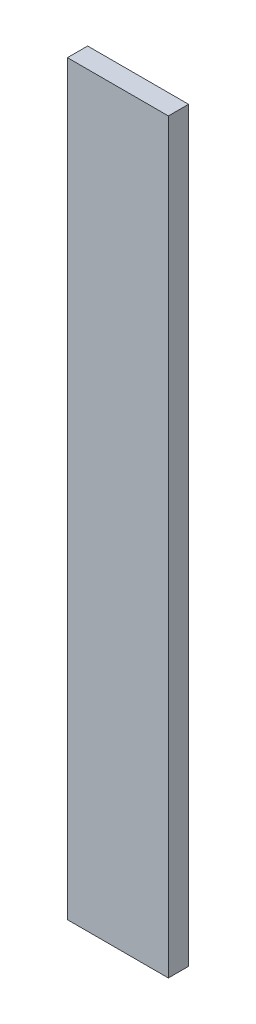
ISO-10303-21;
HEADER;
FILE_DESCRIPTION(('STEP AP214'),'2;1');
FILE_NAME('part.step','',(''),(''),'','','');
FILE_SCHEMA(('AUTOMOTIVE_DESIGN { 1 0 10303 214 1 1 1 1 }'));
ENDSEC;
DATA;
#1=APPLICATION_CONTEXT('core data for automotive mechanical design processes');
#2=APPLICATION_PROTOCOL_DEFINITION('international standard','automotive_design',2000,#1);
#3=PRODUCT_CONTEXT('',#1,'mechanical');
#4=PRODUCT('Part','Part','',(#3));
#5=PRODUCT_RELATED_PRODUCT_CATEGORY('part','',(#4));
#6=PRODUCT_DEFINITION_FORMATION('','',#4);
#7=PRODUCT_DEFINITION_CONTEXT('part definition',#1,'design');
#8=PRODUCT_DEFINITION('design','',#6,#7);
#9=PRODUCT_DEFINITION_SHAPE('','',#8);
#10=(LENGTH_UNIT() NAMED_UNIT(*) SI_UNIT(.MILLI.,.METRE.));
#11=(NAMED_UNIT(*) PLANE_ANGLE_UNIT() SI_UNIT($,.RADIAN.));
#12=(NAMED_UNIT(*) SI_UNIT($,.STERADIAN.) SOLID_ANGLE_UNIT());
#13=UNCERTAINTY_MEASURE_WITH_UNIT(LENGTH_MEASURE(1.E-05),#10,'distance_accuracy_value','');
#14=(GEOMETRIC_REPRESENTATION_CONTEXT(3) GLOBAL_UNCERTAINTY_ASSIGNED_CONTEXT((#13)) GLOBAL_UNIT_ASSIGNED_CONTEXT((#10,
#11,#12)) REPRESENTATION_CONTEXT('',''));
#15=CARTESIAN_POINT('',(0.,0.,0.));
#16=DIRECTION('',(0.,0.,1.));
#17=DIRECTION('',(1.,0.,0.));
#18=AXIS2_PLACEMENT_3D('',#15,#16,#17);
#19=CARTESIAN_POINT('',(50.6216819724827,39.0353646252086,118.017510674416));
#20=DIRECTION('',(-1.,0.,0.));
#21=DIRECTION('',(0.,-1.,0.));
#22=AXIS2_PLACEMENT_3D('',#19,#20,#21);
#23=PLANE('',#22);
#24=DIRECTION('',(0.,-1.,0.));
#25=VECTOR('',#24,1.);
#26=CARTESIAN_POINT('',(50.6216819724827,39.0353646252086,120.017510674416));
#27=LINE('',#26,#25);
#28=CARTESIAN_POINT('',(50.6216819724827,39.0353646252086,120.017510674416));
#29=VERTEX_POINT('',#28);
#30=CARTESIAN_POINT('',(50.6216819724826,-34.9393877242963,120.017510674416));
#31=VERTEX_POINT('',#30);
#32=EDGE_CURVE('E97',#29,#31,#27,.T.);
#33=ORIENTED_EDGE('',*,*,#32,.T.);
#34=DIRECTION('',(0.,0.,1.));
#35=VECTOR('',#34,1.);
#36=CARTESIAN_POINT('',(50.6216819724826,-34.9393877242963,118.017510674416));
#37=LINE('',#36,#35);
#38=CARTESIAN_POINT('',(50.6216819724826,-34.9393877242963,118.017510674416));
#39=VERTEX_POINT('',#38);
#40=EDGE_CURVE('E11',#39,#31,#37,.T.);
#41=ORIENTED_EDGE('',*,*,#40,.F.);
#42=DIRECTION('',(0.,-1.,0.));
#43=VECTOR('',#42,1.);
#44=CARTESIAN_POINT('',(50.6216819724827,39.0353646252086,118.017510674416));
#45=LINE('',#44,#43);
#46=CARTESIAN_POINT('',(50.6216819724827,39.0353646252086,118.017510674416));
#47=VERTEX_POINT('',#46);
#48=EDGE_CURVE('E85',#47,#39,#45,.T.);
#49=ORIENTED_EDGE('',*,*,#48,.F.);
#50=DIRECTION('',(0.,0.,1.));
#51=VECTOR('',#50,1.);
#52=CARTESIAN_POINT('',(50.6216819724827,39.0353646252086,118.017510674416));
#53=LINE('',#52,#51);
#54=EDGE_CURVE('E93',#47,#29,#53,.T.);
#55=ORIENTED_EDGE('',*,*,#54,.T.);
#56=EDGE_LOOP('',(#33,#41,#49,#55));
#57=FACE_BOUND('',#56,.T.);
#58=ADVANCED_FACE('F34',(#57),#23,.F.);
#59=CARTESIAN_POINT('',(50.6216819724826,-34.9393877242963,118.017510674416));
#60=DIRECTION('',(0.,1.,0.));
#61=DIRECTION('',(0.,0.,1.));
#62=AXIS2_PLACEMENT_3D('',#59,#60,#61);
#63=PLANE('',#62);
#64=DIRECTION('',(-1.,0.,0.));
#65=VECTOR('',#64,1.);
#66=CARTESIAN_POINT('',(50.6216819724826,-34.9393877242963,120.017510674416));
#67=LINE('',#66,#65);
#68=CARTESIAN_POINT('',(40.6216819724826,-34.9393877242963,120.017510674416));
#69=VERTEX_POINT('',#68);
#70=EDGE_CURVE('E89',#31,#69,#67,.T.);
#71=ORIENTED_EDGE('',*,*,#70,.T.);
#72=DIRECTION('',(0.,0.,1.));
#73=VECTOR('',#72,1.);
#74=CARTESIAN_POINT('',(40.6216819724826,-34.9393877242963,118.017510674416));
#75=LINE('',#74,#73);
#76=CARTESIAN_POINT('',(40.6216819724826,-34.9393877242963,118.017510674416));
#77=VERTEX_POINT('',#76);
#78=EDGE_CURVE('E42',#77,#69,#75,.T.);
#79=ORIENTED_EDGE('',*,*,#78,.F.);
#80=DIRECTION('',(-1.,0.,0.));
#81=VECTOR('',#80,1.);
#82=CARTESIAN_POINT('',(50.6216819724826,-34.9393877242963,118.017510674416));
#83=LINE('',#82,#81);
#84=EDGE_CURVE('E80',#39,#77,#83,.T.);
#85=ORIENTED_EDGE('',*,*,#84,.F.);
#86=ORIENTED_EDGE('',*,*,#40,.T.);
#87=EDGE_LOOP('',(#71,#79,#85,#86));
#88=FACE_BOUND('',#87,.T.);
#89=ADVANCED_FACE('F88',(#88),#63,.F.);
#90=CARTESIAN_POINT('',(40.6216819724826,39.0353646252086,118.017510674416));
#91=DIRECTION('',(1.,0.,0.));
#92=DIRECTION('',(0.,1.,0.));
#93=AXIS2_PLACEMENT_3D('',#90,#91,#92);
#94=PLANE('',#93);
#95=DIRECTION('',(0.,1.,0.));
#96=VECTOR('',#95,1.);
#97=CARTESIAN_POINT('',(40.6216819724826,39.0353646252086,120.017510674416));
#98=LINE('',#97,#96);
#99=CARTESIAN_POINT('',(40.6216819724826,39.0353646252086,120.017510674416));
#100=VERTEX_POINT('',#99);
#101=EDGE_CURVE('E67',#69,#100,#98,.T.);
#102=ORIENTED_EDGE('',*,*,#101,.T.);
#103=DIRECTION('',(0.,0.,1.));
#104=VECTOR('',#103,1.);
#105=CARTESIAN_POINT('',(40.6216819724826,39.0353646252086,118.017510674416));
#106=LINE('',#105,#104);
#107=CARTESIAN_POINT('',(40.6216819724826,39.0353646252086,118.017510674416));
#108=VERTEX_POINT('',#107);
#109=EDGE_CURVE('E90',#108,#100,#106,.T.);
#110=ORIENTED_EDGE('',*,*,#109,.F.);
#111=DIRECTION('',(0.,1.,0.));
#112=VECTOR('',#111,1.);
#113=CARTESIAN_POINT('',(40.6216819724826,39.0353646252086,118.017510674416));
#114=LINE('',#113,#112);
#115=EDGE_CURVE('E83',#77,#108,#114,.T.);
#116=ORIENTED_EDGE('',*,*,#115,.F.);
#117=ORIENTED_EDGE('',*,*,#78,.T.);
#118=EDGE_LOOP('',(#102,#110,#116,#117));
#119=FACE_BOUND('',#118,.T.);
#120=ADVANCED_FACE('F91',(#119),#94,.F.);
#121=CARTESIAN_POINT('',(50.6216819724827,39.0353646252086,118.017510674416));
#122=DIRECTION('',(0.,-1.,0.));
#123=DIRECTION('',(0.,0.,-1.));
#124=AXIS2_PLACEMENT_3D('',#121,#122,#123);
#125=PLANE('',#124);
#126=DIRECTION('',(1.,0.,0.));
#127=VECTOR('',#126,1.);
#128=CARTESIAN_POINT('',(50.6216819724827,39.0353646252086,120.017510674416));
#129=LINE('',#128,#127);
#130=EDGE_CURVE('E73',#100,#29,#129,.T.);
#131=ORIENTED_EDGE('',*,*,#130,.T.);
#132=ORIENTED_EDGE('',*,*,#54,.F.);
#133=DIRECTION('',(1.,0.,0.));
#134=VECTOR('',#133,1.);
#135=CARTESIAN_POINT('',(50.6216819724827,39.0353646252086,118.017510674416));
#136=LINE('',#135,#134);
#137=EDGE_CURVE('E50',#108,#47,#136,.T.);
#138=ORIENTED_EDGE('',*,*,#137,.F.);
#139=ORIENTED_EDGE('',*,*,#109,.T.);
#140=EDGE_LOOP('',(#131,#132,#138,#139));
#141=FACE_BOUND('',#140,.T.);
#142=ADVANCED_FACE('F104',(#141),#125,.F.);
#143=CARTESIAN_POINT('',(0.,0.,118.017510674416));
#144=DIRECTION('',(0.,0.,-1.));
#145=DIRECTION('',(-1.,0.,0.));
#146=AXIS2_PLACEMENT_3D('',#143,#144,#145);
#147=PLANE('',#146);
#148=ORIENTED_EDGE('',*,*,#48,.T.);
#149=ORIENTED_EDGE('',*,*,#84,.T.);
#150=ORIENTED_EDGE('',*,*,#115,.T.);
#151=ORIENTED_EDGE('',*,*,#137,.T.);
#152=EDGE_LOOP('',(#148,#149,#150,#151));
#153=FACE_BOUND('',#152,.T.);
#154=ADVANCED_FACE('F81',(#153),#147,.T.);
#155=CARTESIAN_POINT('',(0.,0.,120.017510674416));
#156=DIRECTION('',(0.,0.,-1.));
#157=DIRECTION('',(-1.,0.,0.));
#158=AXIS2_PLACEMENT_3D('',#155,#156,#157);
#159=PLANE('',#158);
#160=ORIENTED_EDGE('',*,*,#32,.F.);
#161=ORIENTED_EDGE('',*,*,#130,.F.);
#162=ORIENTED_EDGE('',*,*,#101,.F.);
#163=ORIENTED_EDGE('',*,*,#70,.F.);
#164=EDGE_LOOP('',(#160,#161,#162,#163));
#165=FACE_BOUND('',#164,.T.);
#166=ADVANCED_FACE('F107',(#165),#159,.F.);
#167=CLOSED_SHELL('',(#58,#89,#120,#142,#154,#166));
#168=MANIFOLD_SOLID_BREP('B2',#167);
#169=ADVANCED_BREP_SHAPE_REPRESENTATION('',(#18,#168),#14);
#170=SHAPE_DEFINITION_REPRESENTATION(#9,#169);
ENDSEC;
END-ISO-10303-21;
